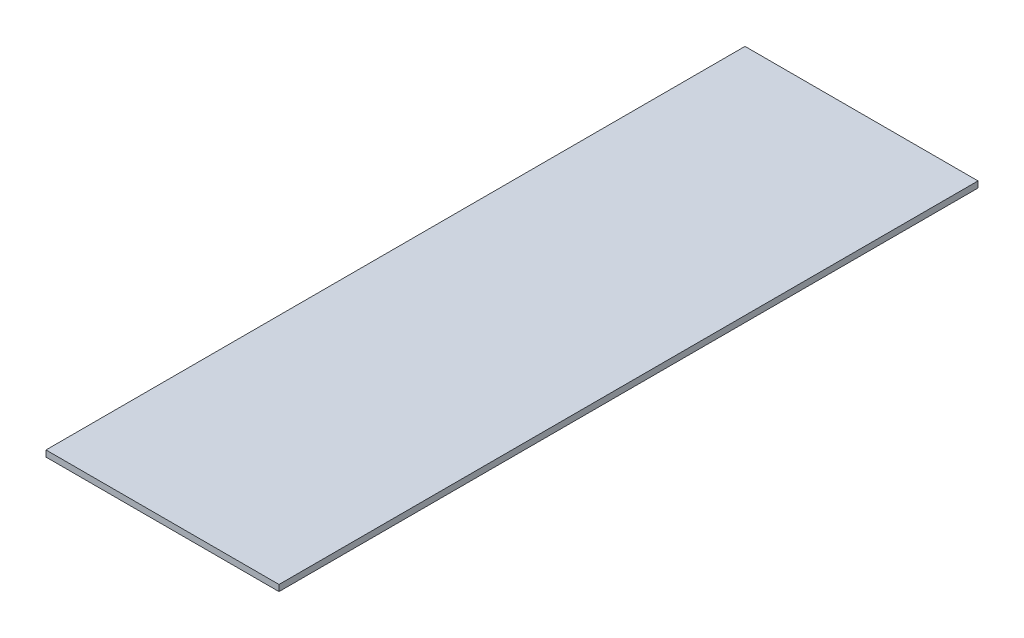
ISO-10303-21;
HEADER;
FILE_DESCRIPTION(('STEP AP214'),'2;1');
FILE_NAME('part.step','',(''),(''),'','','');
FILE_SCHEMA(('AUTOMOTIVE_DESIGN { 1 0 10303 214 1 1 1 1 }'));
ENDSEC;
DATA;
#1=APPLICATION_CONTEXT('core data for automotive mechanical design processes');
#2=APPLICATION_PROTOCOL_DEFINITION('international standard','automotive_design',2000,#1);
#3=PRODUCT_CONTEXT('',#1,'mechanical');
#4=PRODUCT('Part','Part','',(#3));
#5=PRODUCT_RELATED_PRODUCT_CATEGORY('part','',(#4));
#6=PRODUCT_DEFINITION_FORMATION('','',#4);
#7=PRODUCT_DEFINITION_CONTEXT('part definition',#1,'design');
#8=PRODUCT_DEFINITION('design','',#6,#7);
#9=PRODUCT_DEFINITION_SHAPE('','',#8);
#10=(LENGTH_UNIT() NAMED_UNIT(*) SI_UNIT(.MILLI.,.METRE.));
#11=(NAMED_UNIT(*) PLANE_ANGLE_UNIT() SI_UNIT($,.RADIAN.));
#12=(NAMED_UNIT(*) SI_UNIT($,.STERADIAN.) SOLID_ANGLE_UNIT());
#13=UNCERTAINTY_MEASURE_WITH_UNIT(LENGTH_MEASURE(1.E-05),#10,'distance_accuracy_value','');
#14=(GEOMETRIC_REPRESENTATION_CONTEXT(3) GLOBAL_UNCERTAINTY_ASSIGNED_CONTEXT((#13)) GLOBAL_UNIT_ASSIGNED_CONTEXT((#10,
#11,#12)) REPRESENTATION_CONTEXT('',''));
#15=CARTESIAN_POINT('',(0.,0.,0.));
#16=DIRECTION('',(0.,0.,1.));
#17=DIRECTION('',(1.,0.,0.));
#18=AXIS2_PLACEMENT_3D('',#15,#16,#17);
#19=CARTESIAN_POINT('',(9.525,0.508,-28.575));
#20=DIRECTION('',(-1.,0.,0.));
#21=DIRECTION('',(0.,0.,1.));
#22=AXIS2_PLACEMENT_3D('',#19,#20,#21);
#23=PLANE('',#22);
#24=DIRECTION('',(0.,0.,-1.));
#25=VECTOR('',#24,1.);
#26=CARTESIAN_POINT('',(9.525,0.,-28.575));
#27=LINE('',#26,#25);
#28=CARTESIAN_POINT('',(9.525,0.,28.575));
#29=VERTEX_POINT('',#28);
#30=CARTESIAN_POINT('',(9.525,0.,-28.575));
#31=VERTEX_POINT('',#30);
#32=EDGE_CURVE('E97',#29,#31,#27,.T.);
#33=ORIENTED_EDGE('',*,*,#32,.T.);
#34=DIRECTION('',(0.,-1.,0.));
#35=VECTOR('',#34,1.);
#36=CARTESIAN_POINT('',(9.525,0.508,-28.575));
#37=LINE('',#36,#35);
#38=CARTESIAN_POINT('',(9.525,0.508,-28.575));
#39=VERTEX_POINT('',#38);
#40=EDGE_CURVE('E11',#39,#31,#37,.T.);
#41=ORIENTED_EDGE('',*,*,#40,.F.);
#42=DIRECTION('',(0.,0.,-1.));
#43=VECTOR('',#42,1.);
#44=CARTESIAN_POINT('',(9.525,0.508,-28.575));
#45=LINE('',#44,#43);
#46=CARTESIAN_POINT('',(9.525,0.508,28.575));
#47=VERTEX_POINT('',#46);
#48=EDGE_CURVE('E85',#47,#39,#45,.T.);
#49=ORIENTED_EDGE('',*,*,#48,.F.);
#50=DIRECTION('',(0.,-1.,0.));
#51=VECTOR('',#50,1.);
#52=CARTESIAN_POINT('',(9.525,0.508,28.575));
#53=LINE('',#52,#51);
#54=EDGE_CURVE('E93',#47,#29,#53,.T.);
#55=ORIENTED_EDGE('',*,*,#54,.T.);
#56=EDGE_LOOP('',(#33,#41,#49,#55));
#57=FACE_BOUND('',#56,.T.);
#58=ADVANCED_FACE('F34',(#57),#23,.F.);
#59=CARTESIAN_POINT('',(-9.52500000000001,0.508,-28.575));
#60=DIRECTION('',(0.,0.,1.));
#61=DIRECTION('',(1.,0.,0.));
#62=AXIS2_PLACEMENT_3D('',#59,#60,#61);
#63=PLANE('',#62);
#64=DIRECTION('',(-1.,0.,0.));
#65=VECTOR('',#64,1.);
#66=CARTESIAN_POINT('',(-9.52500000000001,0.,-28.575));
#67=LINE('',#66,#65);
#68=CARTESIAN_POINT('',(-9.52500000000001,0.,-28.575));
#69=VERTEX_POINT('',#68);
#70=EDGE_CURVE('E89',#31,#69,#67,.T.);
#71=ORIENTED_EDGE('',*,*,#70,.T.);
#72=DIRECTION('',(0.,-1.,0.));
#73=VECTOR('',#72,1.);
#74=CARTESIAN_POINT('',(-9.52500000000001,0.508,-28.575));
#75=LINE('',#74,#73);
#76=CARTESIAN_POINT('',(-9.52500000000001,0.508,-28.575));
#77=VERTEX_POINT('',#76);
#78=EDGE_CURVE('E42',#77,#69,#75,.T.);
#79=ORIENTED_EDGE('',*,*,#78,.F.);
#80=DIRECTION('',(-1.,0.,0.));
#81=VECTOR('',#80,1.);
#82=CARTESIAN_POINT('',(-9.52500000000001,0.508,-28.575));
#83=LINE('',#82,#81);
#84=EDGE_CURVE('E80',#39,#77,#83,.T.);
#85=ORIENTED_EDGE('',*,*,#84,.F.);
#86=ORIENTED_EDGE('',*,*,#40,.T.);
#87=EDGE_LOOP('',(#71,#79,#85,#86));
#88=FACE_BOUND('',#87,.T.);
#89=ADVANCED_FACE('F88',(#88),#63,.F.);
#90=CARTESIAN_POINT('',(-9.52500000000001,0.508,-28.575));
#91=DIRECTION('',(1.,0.,0.));
#92=DIRECTION('',(0.,0.,-1.));
#93=AXIS2_PLACEMENT_3D('',#90,#91,#92);
#94=PLANE('',#93);
#95=DIRECTION('',(0.,0.,1.));
#96=VECTOR('',#95,1.);
#97=CARTESIAN_POINT('',(-9.52500000000001,0.,-28.575));
#98=LINE('',#97,#96);
#99=CARTESIAN_POINT('',(-9.525,0.,28.575));
#100=VERTEX_POINT('',#99);
#101=EDGE_CURVE('E67',#69,#100,#98,.T.);
#102=ORIENTED_EDGE('',*,*,#101,.T.);
#103=DIRECTION('',(0.,-1.,0.));
#104=VECTOR('',#103,1.);
#105=CARTESIAN_POINT('',(-9.525,0.508,28.575));
#106=LINE('',#105,#104);
#107=CARTESIAN_POINT('',(-9.525,0.508,28.575));
#108=VERTEX_POINT('',#107);
#109=EDGE_CURVE('E90',#108,#100,#106,.T.);
#110=ORIENTED_EDGE('',*,*,#109,.F.);
#111=DIRECTION('',(0.,0.,1.));
#112=VECTOR('',#111,1.);
#113=CARTESIAN_POINT('',(-9.52500000000001,0.508,-28.575));
#114=LINE('',#113,#112);
#115=EDGE_CURVE('E83',#77,#108,#114,.T.);
#116=ORIENTED_EDGE('',*,*,#115,.F.);
#117=ORIENTED_EDGE('',*,*,#78,.T.);
#118=EDGE_LOOP('',(#102,#110,#116,#117));
#119=FACE_BOUND('',#118,.T.);
#120=ADVANCED_FACE('F91',(#119),#94,.F.);
#121=CARTESIAN_POINT('',(-9.525,0.508,28.575));
#122=DIRECTION('',(0.,0.,-1.));
#123=DIRECTION('',(-1.,0.,0.));
#124=AXIS2_PLACEMENT_3D('',#121,#122,#123);
#125=PLANE('',#124);
#126=DIRECTION('',(1.,0.,0.));
#127=VECTOR('',#126,1.);
#128=CARTESIAN_POINT('',(-9.525,0.,28.575));
#129=LINE('',#128,#127);
#130=EDGE_CURVE('E73',#100,#29,#129,.T.);
#131=ORIENTED_EDGE('',*,*,#130,.T.);
#132=ORIENTED_EDGE('',*,*,#54,.F.);
#133=DIRECTION('',(1.,0.,0.));
#134=VECTOR('',#133,1.);
#135=CARTESIAN_POINT('',(-9.525,0.508,28.575));
#136=LINE('',#135,#134);
#137=EDGE_CURVE('E50',#108,#47,#136,.T.);
#138=ORIENTED_EDGE('',*,*,#137,.F.);
#139=ORIENTED_EDGE('',*,*,#109,.T.);
#140=EDGE_LOOP('',(#131,#132,#138,#139));
#141=FACE_BOUND('',#140,.T.);
#142=ADVANCED_FACE('F104',(#141),#125,.F.);
#143=CARTESIAN_POINT('',(0.,0.508,0.));
#144=DIRECTION('',(0.,1.,0.));
#145=DIRECTION('',(0.,0.,1.));
#146=AXIS2_PLACEMENT_3D('',#143,#144,#145);
#147=PLANE('',#146);
#148=ORIENTED_EDGE('',*,*,#48,.T.);
#149=ORIENTED_EDGE('',*,*,#84,.T.);
#150=ORIENTED_EDGE('',*,*,#115,.T.);
#151=ORIENTED_EDGE('',*,*,#137,.T.);
#152=EDGE_LOOP('',(#148,#149,#150,#151));
#153=FACE_BOUND('',#152,.T.);
#154=ADVANCED_FACE('F81',(#153),#147,.T.);
#155=CARTESIAN_POINT('',(0.,0.,0.));
#156=DIRECTION('',(0.,1.,0.));
#157=DIRECTION('',(0.,0.,1.));
#158=AXIS2_PLACEMENT_3D('',#155,#156,#157);
#159=PLANE('',#158);
#160=ORIENTED_EDGE('',*,*,#32,.F.);
#161=ORIENTED_EDGE('',*,*,#130,.F.);
#162=ORIENTED_EDGE('',*,*,#101,.F.);
#163=ORIENTED_EDGE('',*,*,#70,.F.);
#164=EDGE_LOOP('',(#160,#161,#162,#163));
#165=FACE_BOUND('',#164,.T.);
#166=ADVANCED_FACE('F107',(#165),#159,.F.);
#167=CLOSED_SHELL('',(#58,#89,#120,#142,#154,#166));
#168=MANIFOLD_SOLID_BREP('B2',#167);
#169=ADVANCED_BREP_SHAPE_REPRESENTATION('',(#18,#168),#14);
#170=SHAPE_DEFINITION_REPRESENTATION(#9,#169);
ENDSEC;
END-ISO-10303-21;
